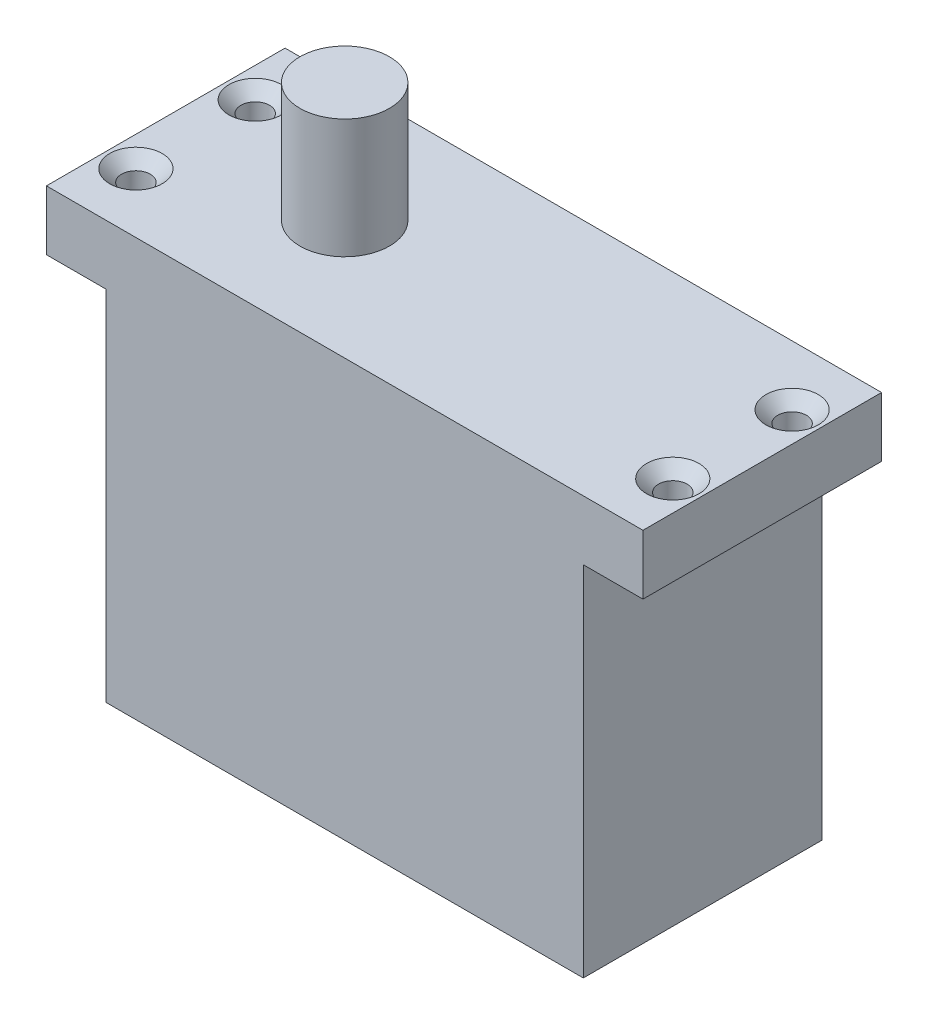
ISO-10303-21;
HEADER;
FILE_DESCRIPTION(('STEP AP214'),'2;1');
FILE_NAME('part.step','',(''),(''),'','','');
FILE_SCHEMA(('AUTOMOTIVE_DESIGN { 1 0 10303 214 1 1 1 1 }'));
ENDSEC;
DATA;
#1=APPLICATION_CONTEXT('core data for automotive mechanical design processes');
#2=APPLICATION_PROTOCOL_DEFINITION('international standard','automotive_design',2000,#1);
#3=PRODUCT_CONTEXT('',#1,'mechanical');
#4=PRODUCT('Part','Part','',(#3));
#5=PRODUCT_RELATED_PRODUCT_CATEGORY('part','',(#4));
#6=PRODUCT_DEFINITION_FORMATION('','',#4);
#7=PRODUCT_DEFINITION_CONTEXT('part definition',#1,'design');
#8=PRODUCT_DEFINITION('design','',#6,#7);
#9=PRODUCT_DEFINITION_SHAPE('','',#8);
#10=(LENGTH_UNIT() NAMED_UNIT(*) SI_UNIT(.MILLI.,.METRE.));
#11=(NAMED_UNIT(*) PLANE_ANGLE_UNIT() SI_UNIT($,.RADIAN.));
#12=(NAMED_UNIT(*) SI_UNIT($,.STERADIAN.) SOLID_ANGLE_UNIT());
#13=UNCERTAINTY_MEASURE_WITH_UNIT(LENGTH_MEASURE(1.E-05),#10,'distance_accuracy_value','');
#14=(GEOMETRIC_REPRESENTATION_CONTEXT(3) GLOBAL_UNCERTAINTY_ASSIGNED_CONTEXT((#13)) GLOBAL_UNIT_ASSIGNED_CONTEXT((#10,
#11,#12)) REPRESENTATION_CONTEXT('',''));
#15=CARTESIAN_POINT('',(0.,0.,0.));
#16=DIRECTION('',(0.,0.,1.));
#17=DIRECTION('',(1.,0.,0.));
#18=AXIS2_PLACEMENT_3D('',#15,#16,#17);
#19=CARTESIAN_POINT('',(20.,35.,-10.));
#20=DIRECTION('',(-1.,0.,0.));
#21=DIRECTION('',(0.,0.,1.));
#22=AXIS2_PLACEMENT_3D('',#19,#20,#21);
#23=PLANE('',#22);
#24=DIRECTION('',(0.,0.,-1.));
#25=VECTOR('',#24,1.);
#26=CARTESIAN_POINT('',(20.,30.,10.));
#27=LINE('',#26,#25);
#28=CARTESIAN_POINT('',(20.,30.,10.));
#29=VERTEX_POINT('',#28);
#30=CARTESIAN_POINT('',(20.,30.,-10.));
#31=VERTEX_POINT('',#30);
#32=EDGE_CURVE('E52',#29,#31,#27,.T.);
#33=ORIENTED_EDGE('',*,*,#32,.F.);
#34=DIRECTION('',(0.,-1.,0.));
#35=VECTOR('',#34,1.);
#36=CARTESIAN_POINT('',(20.,35.,10.));
#37=LINE('',#36,#35);
#38=CARTESIAN_POINT('',(20.,0.,10.));
#39=VERTEX_POINT('',#38);
#40=EDGE_CURVE('E154',#29,#39,#37,.T.);
#41=ORIENTED_EDGE('',*,*,#40,.T.);
#42=DIRECTION('',(0.,0.,-1.));
#43=VECTOR('',#42,1.);
#44=CARTESIAN_POINT('',(20.,0.,-10.));
#45=LINE('',#44,#43);
#46=CARTESIAN_POINT('',(20.,0.,-10.));
#47=VERTEX_POINT('',#46);
#48=EDGE_CURVE('E151',#39,#47,#45,.T.);
#49=ORIENTED_EDGE('',*,*,#48,.T.);
#50=DIRECTION('',(0.,-1.,0.));
#51=VECTOR('',#50,1.);
#52=CARTESIAN_POINT('',(20.,35.,-10.));
#53=LINE('',#52,#51);
#54=EDGE_CURVE('E11',#31,#47,#53,.T.);
#55=ORIENTED_EDGE('',*,*,#54,.F.);
#56=EDGE_LOOP('',(#33,#41,#49,#55));
#57=FACE_BOUND('',#56,.T.);
#58=ADVANCED_FACE('F36',(#57),#23,.F.);
#59=CARTESIAN_POINT('',(-20.,35.,-10.));
#60=DIRECTION('',(0.,0.,1.));
#61=DIRECTION('',(1.,0.,0.));
#62=AXIS2_PLACEMENT_3D('',#59,#60,#61);
#63=PLANE('',#62);
#64=DIRECTION('',(-1.,0.,0.));
#65=VECTOR('',#64,1.);
#66=CARTESIAN_POINT('',(-20.,0.,-10.));
#67=LINE('',#66,#65);
#68=CARTESIAN_POINT('',(-20.,0.,-10.));
#69=VERTEX_POINT('',#68);
#70=EDGE_CURVE('E157',#47,#69,#67,.T.);
#71=ORIENTED_EDGE('',*,*,#70,.T.);
#72=DIRECTION('',(0.,-1.,0.));
#73=VECTOR('',#72,1.);
#74=CARTESIAN_POINT('',(-20.,35.,-10.));
#75=LINE('',#74,#73);
#76=CARTESIAN_POINT('',(-20.,30.,-10.));
#77=VERTEX_POINT('',#76);
#78=EDGE_CURVE('E44',#77,#69,#75,.T.);
#79=ORIENTED_EDGE('',*,*,#78,.F.);
#80=DIRECTION('',(-1.,0.,0.));
#81=VECTOR('',#80,1.);
#82=CARTESIAN_POINT('',(-20.,30.,-10.));
#83=LINE('',#82,#81);
#84=CARTESIAN_POINT('',(-25.,30.,-10.));
#85=VERTEX_POINT('',#84);
#86=EDGE_CURVE('E60',#77,#85,#83,.T.);
#87=ORIENTED_EDGE('',*,*,#86,.T.);
#88=DIRECTION('',(0.,1.,0.));
#89=VECTOR('',#88,1.);
#90=CARTESIAN_POINT('',(-25.,30.,-10.));
#91=LINE('',#90,#89);
#92=CARTESIAN_POINT('',(-25.,35.,-10.));
#93=VERTEX_POINT('',#92);
#94=EDGE_CURVE('E110',#85,#93,#91,.T.);
#95=ORIENTED_EDGE('',*,*,#94,.T.);
#96=DIRECTION('',(-1.,0.,0.));
#97=VECTOR('',#96,1.);
#98=CARTESIAN_POINT('',(-20.,35.,-10.));
#99=LINE('',#98,#97);
#100=CARTESIAN_POINT('',(25.,35.,-10.));
#101=VERTEX_POINT('',#100);
#102=EDGE_CURVE('E102',#101,#93,#99,.T.);
#103=ORIENTED_EDGE('',*,*,#102,.F.);
#104=DIRECTION('',(0.,1.,0.));
#105=VECTOR('',#104,1.);
#106=CARTESIAN_POINT('',(25.,30.,-10.));
#107=LINE('',#106,#105);
#108=CARTESIAN_POINT('',(25.,30.,-10.));
#109=VERTEX_POINT('',#108);
#110=EDGE_CURVE('E107',#109,#101,#107,.T.);
#111=ORIENTED_EDGE('',*,*,#110,.F.);
#112=DIRECTION('',(1.,0.,0.));
#113=VECTOR('',#112,1.);
#114=CARTESIAN_POINT('',(20.,30.,-10.));
#115=LINE('',#114,#113);
#116=EDGE_CURVE('E139',#31,#109,#115,.T.);
#117=ORIENTED_EDGE('',*,*,#116,.F.);
#118=ORIENTED_EDGE('',*,*,#54,.T.);
#119=EDGE_LOOP('',(#71,#79,#87,#95,#103,#111,#117,#118));
#120=FACE_BOUND('',#119,.T.);
#121=ADVANCED_FACE('F105',(#120),#63,.F.);
#122=CARTESIAN_POINT('',(-20.,35.,-10.));
#123=DIRECTION('',(1.,0.,0.));
#124=DIRECTION('',(0.,0.,-1.));
#125=AXIS2_PLACEMENT_3D('',#122,#123,#124);
#126=PLANE('',#125);
#127=DIRECTION('',(0.,-1.,0.));
#128=VECTOR('',#127,1.);
#129=CARTESIAN_POINT('',(-20.,35.,10.));
#130=LINE('',#129,#128);
#131=CARTESIAN_POINT('',(-20.,30.,10.));
#132=VERTEX_POINT('',#131);
#133=CARTESIAN_POINT('',(-20.,0.,10.));
#134=VERTEX_POINT('',#133);
#135=EDGE_CURVE('E165',#132,#134,#130,.T.);
#136=ORIENTED_EDGE('',*,*,#135,.F.);
#137=DIRECTION('',(0.,0.,-1.));
#138=VECTOR('',#137,1.);
#139=CARTESIAN_POINT('',(-20.,30.,10.));
#140=LINE('',#139,#138);
#141=EDGE_CURVE('E132',#132,#77,#140,.T.);
#142=ORIENTED_EDGE('',*,*,#141,.T.);
#143=ORIENTED_EDGE('',*,*,#78,.T.);
#144=DIRECTION('',(0.,0.,1.));
#145=VECTOR('',#144,1.);
#146=CARTESIAN_POINT('',(-20.,0.,-10.));
#147=LINE('',#146,#145);
#148=EDGE_CURVE('E159',#69,#134,#147,.T.);
#149=ORIENTED_EDGE('',*,*,#148,.T.);
#150=EDGE_LOOP('',(#136,#142,#143,#149));
#151=FACE_BOUND('',#150,.T.);
#152=ADVANCED_FACE('F218',(#151),#126,.F.);
#153=CARTESIAN_POINT('',(-20.,35.,10.));
#154=DIRECTION('',(0.,0.,-1.));
#155=DIRECTION('',(-1.,0.,0.));
#156=AXIS2_PLACEMENT_3D('',#153,#154,#155);
#157=PLANE('',#156);
#158=DIRECTION('',(1.,0.,0.));
#159=VECTOR('',#158,1.);
#160=CARTESIAN_POINT('',(-20.,0.,10.));
#161=LINE('',#160,#159);
#162=EDGE_CURVE('E116',#134,#39,#161,.T.);
#163=ORIENTED_EDGE('',*,*,#162,.T.);
#164=ORIENTED_EDGE('',*,*,#40,.F.);
#165=DIRECTION('',(1.,0.,0.));
#166=VECTOR('',#165,1.);
#167=CARTESIAN_POINT('',(20.,30.,10.));
#168=LINE('',#167,#166);
#169=CARTESIAN_POINT('',(25.,30.,10.));
#170=VERTEX_POINT('',#169);
#171=EDGE_CURVE('E130',#29,#170,#168,.T.);
#172=ORIENTED_EDGE('',*,*,#171,.T.);
#173=DIRECTION('',(0.,1.,0.));
#174=VECTOR('',#173,1.);
#175=CARTESIAN_POINT('',(25.,30.,10.));
#176=LINE('',#175,#174);
#177=CARTESIAN_POINT('',(25.,35.,10.));
#178=VERTEX_POINT('',#177);
#179=EDGE_CURVE('E124',#170,#178,#176,.T.);
#180=ORIENTED_EDGE('',*,*,#179,.T.);
#181=DIRECTION('',(1.,0.,0.));
#182=VECTOR('',#181,1.);
#183=CARTESIAN_POINT('',(-20.,35.,10.));
#184=LINE('',#183,#182);
#185=CARTESIAN_POINT('',(-25.,35.,10.));
#186=VERTEX_POINT('',#185);
#187=EDGE_CURVE('E115',#186,#178,#184,.T.);
#188=ORIENTED_EDGE('',*,*,#187,.F.);
#189=DIRECTION('',(0.,1.,0.));
#190=VECTOR('',#189,1.);
#191=CARTESIAN_POINT('',(-25.,30.,10.));
#192=LINE('',#191,#190);
#193=CARTESIAN_POINT('',(-25.,30.,10.));
#194=VERTEX_POINT('',#193);
#195=EDGE_CURVE('E148',#194,#186,#192,.T.);
#196=ORIENTED_EDGE('',*,*,#195,.F.);
#197=DIRECTION('',(-1.,0.,0.));
#198=VECTOR('',#197,1.);
#199=CARTESIAN_POINT('',(-20.,30.,10.));
#200=LINE('',#199,#198);
#201=EDGE_CURVE('E146',#132,#194,#200,.T.);
#202=ORIENTED_EDGE('',*,*,#201,.F.);
#203=ORIENTED_EDGE('',*,*,#135,.T.);
#204=EDGE_LOOP('',(#163,#164,#172,#180,#188,#196,#202,#203));
#205=FACE_BOUND('',#204,.T.);
#206=ADVANCED_FACE('F204',(#205),#157,.F.);
#207=CARTESIAN_POINT('',(0.,35.,0.));
#208=DIRECTION('',(0.,1.,0.));
#209=DIRECTION('',(0.,0.,1.));
#210=AXIS2_PLACEMENT_3D('',#207,#208,#209);
#211=PLANE('',#210);
#212=CARTESIAN_POINT('',(-22.5,35.,5.));
#213=DIRECTION('',(0.,1.,0.));
#214=DIRECTION('',(0.,0.,1.));
#215=AXIS2_PLACEMENT_3D('',#212,#213,#214);
#216=CIRCLE('',#215,2.2);
#217=CARTESIAN_POINT('',(-22.5,35.,7.2));
#218=VERTEX_POINT('',#217);
#219=EDGE_CURVE('E250',#218,#218,#216,.T.);
#220=ORIENTED_EDGE('',*,*,#219,.F.);
#221=EDGE_LOOP('',(#220));
#222=FACE_BOUND('',#221,.T.);
#223=CARTESIAN_POINT('',(-22.5,35.,-5.));
#224=DIRECTION('',(0.,1.,0.));
#225=DIRECTION('',(0.,0.,1.));
#226=AXIS2_PLACEMENT_3D('',#223,#224,#225);
#227=CIRCLE('',#226,2.2);
#228=CARTESIAN_POINT('',(-22.5,35.,-2.8));
#229=VERTEX_POINT('',#228);
#230=EDGE_CURVE('E186',#229,#229,#227,.T.);
#231=ORIENTED_EDGE('',*,*,#230,.F.);
#232=EDGE_LOOP('',(#231));
#233=FACE_BOUND('',#232,.T.);
#234=CARTESIAN_POINT('',(22.5,35.,5.));
#235=DIRECTION('',(0.,1.,0.));
#236=DIRECTION('',(0.,0.,1.));
#237=AXIS2_PLACEMENT_3D('',#234,#235,#236);
#238=CIRCLE('',#237,2.2);
#239=CARTESIAN_POINT('',(22.5,35.,7.2));
#240=VERTEX_POINT('',#239);
#241=EDGE_CURVE('E179',#240,#240,#238,.T.);
#242=ORIENTED_EDGE('',*,*,#241,.F.);
#243=EDGE_LOOP('',(#242));
#244=FACE_BOUND('',#243,.T.);
#245=CARTESIAN_POINT('',(22.5,35.,-5.));
#246=DIRECTION('',(0.,1.,0.));
#247=DIRECTION('',(0.,0.,1.));
#248=AXIS2_PLACEMENT_3D('',#245,#246,#247);
#249=CIRCLE('',#248,2.2);
#250=CARTESIAN_POINT('',(22.5,35.,-2.8));
#251=VERTEX_POINT('',#250);
#252=EDGE_CURVE('E175',#251,#251,#249,.T.);
#253=ORIENTED_EDGE('',*,*,#252,.F.);
#254=EDGE_LOOP('',(#253));
#255=FACE_BOUND('',#254,.T.);
#256=CARTESIAN_POINT('',(-10.,35.,0.));
#257=DIRECTION('',(0.,1.,0.));
#258=DIRECTION('',(0.,0.,1.));
#259=AXIS2_PLACEMENT_3D('',#256,#257,#258);
#260=CIRCLE('',#259,3.75);
#261=CARTESIAN_POINT('',(-10.,35.,3.75));
#262=VERTEX_POINT('',#261);
#263=EDGE_CURVE('E171',#262,#262,#260,.T.);
#264=ORIENTED_EDGE('',*,*,#263,.F.);
#265=EDGE_LOOP('',(#264));
#266=FACE_BOUND('',#265,.T.);
#267=ORIENTED_EDGE('',*,*,#187,.T.);
#268=DIRECTION('',(0.,0.,-1.));
#269=VECTOR('',#268,1.);
#270=CARTESIAN_POINT('',(25.,35.,10.));
#271=LINE('',#270,#269);
#272=EDGE_CURVE('E121',#178,#101,#271,.T.);
#273=ORIENTED_EDGE('',*,*,#272,.T.);
#274=ORIENTED_EDGE('',*,*,#102,.T.);
#275=DIRECTION('',(0.,0.,-1.));
#276=VECTOR('',#275,1.);
#277=CARTESIAN_POINT('',(-25.,35.,10.));
#278=LINE('',#277,#276);
#279=EDGE_CURVE('E129',#186,#93,#278,.T.);
#280=ORIENTED_EDGE('',*,*,#279,.F.);
#281=EDGE_LOOP('',(#267,#273,#274,#280));
#282=FACE_BOUND('',#281,.T.);
#283=ADVANCED_FACE('F127',(#222,#233,#244,#255,#266,#282),#211,.T.);
#284=CARTESIAN_POINT('',(0.,0.,0.));
#285=DIRECTION('',(0.,1.,0.));
#286=DIRECTION('',(0.,0.,1.));
#287=AXIS2_PLACEMENT_3D('',#284,#285,#286);
#288=PLANE('',#287);
#289=ORIENTED_EDGE('',*,*,#48,.F.);
#290=ORIENTED_EDGE('',*,*,#162,.F.);
#291=ORIENTED_EDGE('',*,*,#148,.F.);
#292=ORIENTED_EDGE('',*,*,#70,.F.);
#293=EDGE_LOOP('',(#289,#290,#291,#292));
#294=FACE_BOUND('',#293,.T.);
#295=ADVANCED_FACE('F214',(#294),#288,.F.);
#296=CARTESIAN_POINT('',(-25.,30.,10.));
#297=DIRECTION('',(1.,0.,0.));
#298=DIRECTION('',(0.,0.,-1.));
#299=AXIS2_PLACEMENT_3D('',#296,#297,#298);
#300=PLANE('',#299);
#301=ORIENTED_EDGE('',*,*,#279,.T.);
#302=ORIENTED_EDGE('',*,*,#94,.F.);
#303=DIRECTION('',(0.,0.,-1.));
#304=VECTOR('',#303,1.);
#305=CARTESIAN_POINT('',(-25.,30.,10.));
#306=LINE('',#305,#304);
#307=EDGE_CURVE('E144',#194,#85,#306,.T.);
#308=ORIENTED_EDGE('',*,*,#307,.F.);
#309=ORIENTED_EDGE('',*,*,#195,.T.);
#310=EDGE_LOOP('',(#301,#302,#308,#309));
#311=FACE_BOUND('',#310,.T.);
#312=ADVANCED_FACE('F222',(#311),#300,.F.);
#313=CARTESIAN_POINT('',(0.,30.,0.));
#314=DIRECTION('',(0.,1.,0.));
#315=DIRECTION('',(0.,0.,1.));
#316=AXIS2_PLACEMENT_3D('',#313,#314,#315);
#317=PLANE('',#316);
#318=CARTESIAN_POINT('',(-22.5,30.,5.));
#319=DIRECTION('',(0.,1.,0.));
#320=DIRECTION('',(0.,0.,1.));
#321=AXIS2_PLACEMENT_3D('',#318,#319,#320);
#322=CIRCLE('',#321,1.19999999999999);
#323=CARTESIAN_POINT('',(-22.5,30.,6.19999999999999));
#324=VERTEX_POINT('',#323);
#325=EDGE_CURVE('E39',#324,#324,#322,.T.);
#326=ORIENTED_EDGE('',*,*,#325,.T.);
#327=EDGE_LOOP('',(#326));
#328=FACE_BOUND('',#327,.T.);
#329=CARTESIAN_POINT('',(-22.5,30.,-5.));
#330=DIRECTION('',(0.,1.,0.));
#331=DIRECTION('',(0.,0.,1.));
#332=AXIS2_PLACEMENT_3D('',#329,#330,#331);
#333=CIRCLE('',#332,1.19999999999999);
#334=CARTESIAN_POINT('',(-22.5,30.,-3.80000000000001));
#335=VERTEX_POINT('',#334);
#336=EDGE_CURVE('E177',#335,#335,#333,.T.);
#337=ORIENTED_EDGE('',*,*,#336,.T.);
#338=EDGE_LOOP('',(#337));
#339=FACE_BOUND('',#338,.T.);
#340=ORIENTED_EDGE('',*,*,#141,.F.);
#341=ORIENTED_EDGE('',*,*,#201,.T.);
#342=ORIENTED_EDGE('',*,*,#307,.T.);
#343=ORIENTED_EDGE('',*,*,#86,.F.);
#344=EDGE_LOOP('',(#340,#341,#342,#343));
#345=FACE_BOUND('',#344,.T.);
#346=ADVANCED_FACE('F219',(#328,#339,#345),#317,.F.);
#347=CARTESIAN_POINT('',(25.,30.,10.));
#348=DIRECTION('',(1.,0.,0.));
#349=DIRECTION('',(0.,0.,-1.));
#350=AXIS2_PLACEMENT_3D('',#347,#348,#349);
#351=PLANE('',#350);
#352=ORIENTED_EDGE('',*,*,#272,.F.);
#353=ORIENTED_EDGE('',*,*,#179,.F.);
#354=DIRECTION('',(0.,0.,-1.));
#355=VECTOR('',#354,1.);
#356=CARTESIAN_POINT('',(25.,30.,10.));
#357=LINE('',#356,#355);
#358=EDGE_CURVE('E123',#170,#109,#357,.T.);
#359=ORIENTED_EDGE('',*,*,#358,.T.);
#360=ORIENTED_EDGE('',*,*,#110,.T.);
#361=EDGE_LOOP('',(#352,#353,#359,#360));
#362=FACE_BOUND('',#361,.T.);
#363=ADVANCED_FACE('F120',(#362),#351,.T.);
#364=CARTESIAN_POINT('',(0.,30.,0.));
#365=DIRECTION('',(0.,1.,0.));
#366=DIRECTION('',(0.,0.,1.));
#367=AXIS2_PLACEMENT_3D('',#364,#365,#366);
#368=PLANE('',#367);
#369=CARTESIAN_POINT('',(22.5,30.,5.));
#370=DIRECTION('',(0.,1.,0.));
#371=DIRECTION('',(0.,0.,1.));
#372=AXIS2_PLACEMENT_3D('',#369,#370,#371);
#373=CIRCLE('',#372,1.19999999999999);
#374=CARTESIAN_POINT('',(22.5,30.,6.19999999999999));
#375=VERTEX_POINT('',#374);
#376=EDGE_CURVE('E173',#375,#375,#373,.T.);
#377=ORIENTED_EDGE('',*,*,#376,.T.);
#378=EDGE_LOOP('',(#377));
#379=FACE_BOUND('',#378,.T.);
#380=CARTESIAN_POINT('',(22.5,30.,-5.));
#381=DIRECTION('',(0.,1.,0.));
#382=DIRECTION('',(0.,0.,1.));
#383=AXIS2_PLACEMENT_3D('',#380,#381,#382);
#384=CIRCLE('',#383,1.19999999999999);
#385=CARTESIAN_POINT('',(22.5,30.,-3.80000000000001));
#386=VERTEX_POINT('',#385);
#387=EDGE_CURVE('E168',#386,#386,#384,.T.);
#388=ORIENTED_EDGE('',*,*,#387,.T.);
#389=EDGE_LOOP('',(#388));
#390=FACE_BOUND('',#389,.T.);
#391=ORIENTED_EDGE('',*,*,#171,.F.);
#392=ORIENTED_EDGE('',*,*,#32,.T.);
#393=ORIENTED_EDGE('',*,*,#116,.T.);
#394=ORIENTED_EDGE('',*,*,#358,.F.);
#395=EDGE_LOOP('',(#391,#392,#393,#394));
#396=FACE_BOUND('',#395,.T.);
#397=ADVANCED_FACE('F208',(#379,#390,#396),#368,.F.);
#398=CARTESIAN_POINT('',(-10.,45.,0.));
#399=DIRECTION('',(0.,-1.,0.));
#400=DIRECTION('',(0.,0.,-1.));
#401=AXIS2_PLACEMENT_3D('',#398,#399,#400);
#402=CYLINDRICAL_SURFACE('',#401,3.75);
#403=CARTESIAN_POINT('',(-10.,45.,0.));
#404=DIRECTION('',(0.,1.,0.));
#405=DIRECTION('',(0.,0.,1.));
#406=AXIS2_PLACEMENT_3D('',#403,#404,#405);
#407=CIRCLE('',#406,3.75);
#408=CARTESIAN_POINT('',(-10.,45.,3.75));
#409=VERTEX_POINT('',#408);
#410=EDGE_CURVE('E125',#409,#409,#407,.T.);
#411=ORIENTED_EDGE('',*,*,#410,.F.);
#412=EDGE_LOOP('',(#411));
#413=FACE_BOUND('',#412,.T.);
#414=ORIENTED_EDGE('',*,*,#263,.T.);
#415=EDGE_LOOP('',(#414));
#416=FACE_BOUND('',#415,.T.);
#417=ADVANCED_FACE('F259',(#413,#416),#402,.T.);
#418=CARTESIAN_POINT('',(-10.,45.,0.));
#419=DIRECTION('',(0.,1.,0.));
#420=DIRECTION('',(0.,0.,1.));
#421=AXIS2_PLACEMENT_3D('',#418,#419,#420);
#422=PLANE('',#421);
#423=ORIENTED_EDGE('',*,*,#410,.T.);
#424=EDGE_LOOP('',(#423));
#425=FACE_BOUND('',#424,.T.);
#426=ADVANCED_FACE('F261',(#425),#422,.T.);
#427=CARTESIAN_POINT('',(22.5,35.,-5.));
#428=DIRECTION('',(0.,1.,0.));
#429=DIRECTION('',(0.,0.,1.));
#430=AXIS2_PLACEMENT_3D('',#427,#428,#429);
#431=CYLINDRICAL_SURFACE('',#430,1.19999999999999);
#432=CARTESIAN_POINT('',(22.5,34.,-5.));
#433=DIRECTION('',(0.,1.,0.));
#434=DIRECTION('',(0.,0.,1.));
#435=AXIS2_PLACEMENT_3D('',#432,#433,#434);
#436=CIRCLE('',#435,1.2);
#437=CARTESIAN_POINT('',(22.5,34.,-3.8));
#438=VERTEX_POINT('',#437);
#439=EDGE_CURVE('E172',#438,#438,#436,.T.);
#440=ORIENTED_EDGE('',*,*,#439,.T.);
#441=EDGE_LOOP('',(#440));
#442=FACE_BOUND('',#441,.T.);
#443=ORIENTED_EDGE('',*,*,#387,.F.);
#444=EDGE_LOOP('',(#443));
#445=FACE_BOUND('',#444,.T.);
#446=ADVANCED_FACE('F268',(#442,#445),#431,.F.);
#447=CARTESIAN_POINT('',(22.5,35.,-5.));
#448=DIRECTION('',(0.,1.,0.));
#449=DIRECTION('',(0.,0.,1.));
#450=AXIS2_PLACEMENT_3D('',#447,#448,#449);
#451=CONICAL_SURFACE('',#450,2.2,0.78539816339745);
#452=ORIENTED_EDGE('',*,*,#439,.F.);
#453=EDGE_LOOP('',(#452));
#454=FACE_BOUND('',#453,.T.);
#455=ORIENTED_EDGE('',*,*,#252,.T.);
#456=EDGE_LOOP('',(#455));
#457=FACE_BOUND('',#456,.T.);
#458=ADVANCED_FACE('F298',(#454,#457),#451,.F.);
#459=CARTESIAN_POINT('',(22.5,35.,5.));
#460=DIRECTION('',(0.,1.,0.));
#461=DIRECTION('',(0.,0.,1.));
#462=AXIS2_PLACEMENT_3D('',#459,#460,#461);
#463=CYLINDRICAL_SURFACE('',#462,1.19999999999999);
#464=CARTESIAN_POINT('',(22.5,34.,5.));
#465=DIRECTION('',(0.,1.,0.));
#466=DIRECTION('',(0.,0.,1.));
#467=AXIS2_PLACEMENT_3D('',#464,#465,#466);
#468=CIRCLE('',#467,1.2);
#469=CARTESIAN_POINT('',(22.5,34.,6.2));
#470=VERTEX_POINT('',#469);
#471=EDGE_CURVE('E176',#470,#470,#468,.T.);
#472=ORIENTED_EDGE('',*,*,#471,.T.);
#473=EDGE_LOOP('',(#472));
#474=FACE_BOUND('',#473,.T.);
#475=ORIENTED_EDGE('',*,*,#376,.F.);
#476=EDGE_LOOP('',(#475));
#477=FACE_BOUND('',#476,.T.);
#478=ADVANCED_FACE('F307',(#474,#477),#463,.F.);
#479=CARTESIAN_POINT('',(22.5,35.,5.));
#480=DIRECTION('',(0.,1.,0.));
#481=DIRECTION('',(0.,0.,1.));
#482=AXIS2_PLACEMENT_3D('',#479,#480,#481);
#483=CONICAL_SURFACE('',#482,2.2,0.78539816339745);
#484=ORIENTED_EDGE('',*,*,#471,.F.);
#485=EDGE_LOOP('',(#484));
#486=FACE_BOUND('',#485,.T.);
#487=ORIENTED_EDGE('',*,*,#241,.T.);
#488=EDGE_LOOP('',(#487));
#489=FACE_BOUND('',#488,.T.);
#490=ADVANCED_FACE('F317',(#486,#489),#483,.F.);
#491=CARTESIAN_POINT('',(-22.5,35.,-5.));
#492=DIRECTION('',(0.,1.,0.));
#493=DIRECTION('',(0.,0.,1.));
#494=AXIS2_PLACEMENT_3D('',#491,#492,#493);
#495=CYLINDRICAL_SURFACE('',#494,1.19999999999999);
#496=CARTESIAN_POINT('',(-22.5,34.,-5.));
#497=DIRECTION('',(0.,1.,0.));
#498=DIRECTION('',(0.,0.,1.));
#499=AXIS2_PLACEMENT_3D('',#496,#497,#498);
#500=CIRCLE('',#499,1.2);
#501=CARTESIAN_POINT('',(-22.5,34.,-3.8));
#502=VERTEX_POINT('',#501);
#503=EDGE_CURVE('E180',#502,#502,#500,.T.);
#504=ORIENTED_EDGE('',*,*,#503,.T.);
#505=EDGE_LOOP('',(#504));
#506=FACE_BOUND('',#505,.T.);
#507=ORIENTED_EDGE('',*,*,#336,.F.);
#508=EDGE_LOOP('',(#507));
#509=FACE_BOUND('',#508,.T.);
#510=ADVANCED_FACE('F326',(#506,#509),#495,.F.);
#511=CARTESIAN_POINT('',(-22.5,35.,-5.));
#512=DIRECTION('',(0.,1.,0.));
#513=DIRECTION('',(0.,0.,1.));
#514=AXIS2_PLACEMENT_3D('',#511,#512,#513);
#515=CONICAL_SURFACE('',#514,2.2,0.78539816339745);
#516=ORIENTED_EDGE('',*,*,#503,.F.);
#517=EDGE_LOOP('',(#516));
#518=FACE_BOUND('',#517,.T.);
#519=ORIENTED_EDGE('',*,*,#230,.T.);
#520=EDGE_LOOP('',(#519));
#521=FACE_BOUND('',#520,.T.);
#522=ADVANCED_FACE('F347',(#518,#521),#515,.F.);
#523=CARTESIAN_POINT('',(-22.5,35.,5.));
#524=DIRECTION('',(0.,1.,0.));
#525=DIRECTION('',(0.,0.,1.));
#526=AXIS2_PLACEMENT_3D('',#523,#524,#525);
#527=CYLINDRICAL_SURFACE('',#526,1.19999999999999);
#528=CARTESIAN_POINT('',(-22.5,34.,5.));
#529=DIRECTION('',(0.,1.,0.));
#530=DIRECTION('',(0.,0.,1.));
#531=AXIS2_PLACEMENT_3D('',#528,#529,#530);
#532=CIRCLE('',#531,1.2);
#533=CARTESIAN_POINT('',(-22.5,34.,6.2));
#534=VERTEX_POINT('',#533);
#535=EDGE_CURVE('E383',#534,#534,#532,.T.);
#536=ORIENTED_EDGE('',*,*,#535,.T.);
#537=EDGE_LOOP('',(#536));
#538=FACE_BOUND('',#537,.T.);
#539=ORIENTED_EDGE('',*,*,#325,.F.);
#540=EDGE_LOOP('',(#539));
#541=FACE_BOUND('',#540,.T.);
#542=ADVANCED_FACE('F356',(#538,#541),#527,.F.);
#543=CARTESIAN_POINT('',(-22.5,35.,5.));
#544=DIRECTION('',(0.,1.,0.));
#545=DIRECTION('',(0.,0.,1.));
#546=AXIS2_PLACEMENT_3D('',#543,#544,#545);
#547=CONICAL_SURFACE('',#546,2.2,0.78539816339745);
#548=ORIENTED_EDGE('',*,*,#535,.F.);
#549=EDGE_LOOP('',(#548));
#550=FACE_BOUND('',#549,.T.);
#551=ORIENTED_EDGE('',*,*,#219,.T.);
#552=EDGE_LOOP('',(#551));
#553=FACE_BOUND('',#552,.T.);
#554=ADVANCED_FACE('F366',(#550,#553),#547,.F.);
#555=CLOSED_SHELL('',(#58,#121,#152,#206,#283,#295,#312,#346,#363,#397,#417,#426,#446,#458,#478,
#490,#510,#522,#542,#554));
#556=MANIFOLD_SOLID_BREP('B2',#555);
#557=ADVANCED_BREP_SHAPE_REPRESENTATION('',(#18,#556),#14);
#558=SHAPE_DEFINITION_REPRESENTATION(#9,#557);
ENDSEC;
END-ISO-10303-21;
